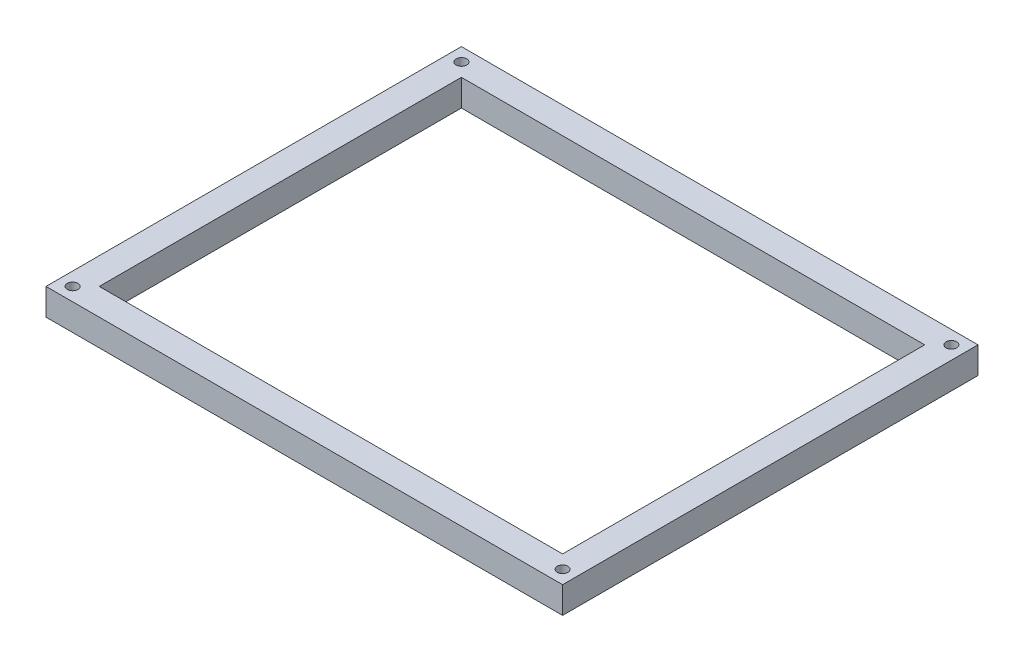
ISO-10303-21;
HEADER;
FILE_DESCRIPTION(('STEP AP214'),'2;1');
FILE_NAME('part.step','',(''),(''),'','','');
FILE_SCHEMA(('AUTOMOTIVE_DESIGN { 1 0 10303 214 1 1 1 1 }'));
ENDSEC;
DATA;
#1=APPLICATION_CONTEXT('core data for automotive mechanical design processes');
#2=APPLICATION_PROTOCOL_DEFINITION('international standard','automotive_design',2000,#1);
#3=PRODUCT_CONTEXT('',#1,'mechanical');
#4=PRODUCT('Part','Part','',(#3));
#5=PRODUCT_RELATED_PRODUCT_CATEGORY('part','',(#4));
#6=PRODUCT_DEFINITION_FORMATION('','',#4);
#7=PRODUCT_DEFINITION_CONTEXT('part definition',#1,'design');
#8=PRODUCT_DEFINITION('design','',#6,#7);
#9=PRODUCT_DEFINITION_SHAPE('','',#8);
#10=(LENGTH_UNIT() NAMED_UNIT(*) SI_UNIT(.MILLI.,.METRE.));
#11=(NAMED_UNIT(*) PLANE_ANGLE_UNIT() SI_UNIT($,.RADIAN.));
#12=(NAMED_UNIT(*) SI_UNIT($,.STERADIAN.) SOLID_ANGLE_UNIT());
#13=UNCERTAINTY_MEASURE_WITH_UNIT(LENGTH_MEASURE(1.E-05),#10,'distance_accuracy_value','');
#14=(GEOMETRIC_REPRESENTATION_CONTEXT(3) GLOBAL_UNCERTAINTY_ASSIGNED_CONTEXT((#13)) GLOBAL_UNIT_ASSIGNED_CONTEXT((#10,
#11,#12)) REPRESENTATION_CONTEXT('',''));
#15=CARTESIAN_POINT('',(0.,0.,0.));
#16=DIRECTION('',(0.,0.,1.));
#17=DIRECTION('',(1.,0.,0.));
#18=AXIS2_PLACEMENT_3D('',#15,#16,#17);
#19=CARTESIAN_POINT('',(0.,10.,0.));
#20=DIRECTION('',(0.,-1.,0.));
#21=DIRECTION('',(0.,0.,-1.));
#22=AXIS2_PLACEMENT_3D('',#19,#20,#21);
#23=PLANE('',#22);
#24=CARTESIAN_POINT('',(92.,10.,-73.));
#25=DIRECTION('',(0.,1.,0.));
#26=DIRECTION('',(0.,0.,1.));
#27=AXIS2_PLACEMENT_3D('',#24,#25,#26);
#28=CIRCLE('',#27,2.);
#29=CARTESIAN_POINT('',(92.,10.,-71.));
#30=VERTEX_POINT('',#29);
#31=EDGE_CURVE('E255',#30,#30,#28,.T.);
#32=ORIENTED_EDGE('',*,*,#31,.F.);
#33=EDGE_LOOP('',(#32));
#34=FACE_BOUND('',#33,.T.);
#35=CARTESIAN_POINT('',(92.,10.,73.));
#36=DIRECTION('',(0.,1.,0.));
#37=DIRECTION('',(0.,0.,1.));
#38=AXIS2_PLACEMENT_3D('',#35,#36,#37);
#39=CIRCLE('',#38,2.);
#40=CARTESIAN_POINT('',(92.,10.,75.));
#41=VERTEX_POINT('',#40);
#42=EDGE_CURVE('E247',#41,#41,#39,.T.);
#43=ORIENTED_EDGE('',*,*,#42,.F.);
#44=EDGE_LOOP('',(#43));
#45=FACE_BOUND('',#44,.T.);
#46=CARTESIAN_POINT('',(-92.0000000000001,10.,73.));
#47=DIRECTION('',(0.,1.,0.));
#48=DIRECTION('',(0.,0.,1.));
#49=AXIS2_PLACEMENT_3D('',#46,#47,#48);
#50=CIRCLE('',#49,2.);
#51=CARTESIAN_POINT('',(-92.0000000000001,10.,75.));
#52=VERTEX_POINT('',#51);
#53=EDGE_CURVE('E240',#52,#52,#50,.T.);
#54=ORIENTED_EDGE('',*,*,#53,.F.);
#55=EDGE_LOOP('',(#54));
#56=FACE_BOUND('',#55,.T.);
#57=CARTESIAN_POINT('',(-92.,10.,-73.));
#58=DIRECTION('',(0.,1.,0.));
#59=DIRECTION('',(0.,0.,1.));
#60=AXIS2_PLACEMENT_3D('',#57,#58,#59);
#61=CIRCLE('',#60,2.);
#62=CARTESIAN_POINT('',(-92.,10.,-71.));
#63=VERTEX_POINT('',#62);
#64=EDGE_CURVE('E244',#63,#63,#61,.T.);
#65=ORIENTED_EDGE('',*,*,#64,.F.);
#66=EDGE_LOOP('',(#65));
#67=FACE_BOUND('',#66,.T.);
#68=DIRECTION('',(0.,0.,-1.));
#69=VECTOR('',#68,1.);
#70=CARTESIAN_POINT('',(97.,10.,78.));
#71=LINE('',#70,#69);
#72=CARTESIAN_POINT('',(97.,10.,78.));
#73=VERTEX_POINT('',#72);
#74=CARTESIAN_POINT('',(97.,10.,-78.));
#75=VERTEX_POINT('',#74);
#76=EDGE_CURVE('E137',#73,#75,#71,.T.);
#77=ORIENTED_EDGE('',*,*,#76,.T.);
#78=DIRECTION('',(-1.,0.,0.));
#79=VECTOR('',#78,1.);
#80=CARTESIAN_POINT('',(-97.,10.,-78.));
#81=LINE('',#80,#79);
#82=CARTESIAN_POINT('',(-97.,10.,-78.));
#83=VERTEX_POINT('',#82);
#84=EDGE_CURVE('E140',#75,#83,#81,.T.);
#85=ORIENTED_EDGE('',*,*,#84,.T.);
#86=DIRECTION('',(0.,0.,1.));
#87=VECTOR('',#86,1.);
#88=CARTESIAN_POINT('',(-97.,10.,78.));
#89=LINE('',#88,#87);
#90=CARTESIAN_POINT('',(-97.,10.,78.));
#91=VERTEX_POINT('',#90);
#92=EDGE_CURVE('E143',#83,#91,#89,.T.);
#93=ORIENTED_EDGE('',*,*,#92,.T.);
#94=DIRECTION('',(1.,0.,0.));
#95=VECTOR('',#94,1.);
#96=CARTESIAN_POINT('',(-97.,10.,78.));
#97=LINE('',#96,#95);
#98=EDGE_CURVE('E145',#91,#73,#97,.T.);
#99=ORIENTED_EDGE('',*,*,#98,.T.);
#100=EDGE_LOOP('',(#77,#85,#93,#99));
#101=FACE_BOUND('',#100,.T.);
#102=DIRECTION('',(0.,0.,1.));
#103=VECTOR('',#102,1.);
#104=CARTESIAN_POINT('',(-87.,10.,68.));
#105=LINE('',#104,#103);
#106=CARTESIAN_POINT('',(-87.,10.,-68.));
#107=VERTEX_POINT('',#106);
#108=CARTESIAN_POINT('',(-87.,10.,68.));
#109=VERTEX_POINT('',#108);
#110=EDGE_CURVE('E99',#107,#109,#105,.T.);
#111=ORIENTED_EDGE('',*,*,#110,.F.);
#112=DIRECTION('',(-1.,0.,0.));
#113=VECTOR('',#112,1.);
#114=CARTESIAN_POINT('',(-87.,10.,-68.));
#115=LINE('',#114,#113);
#116=CARTESIAN_POINT('',(87.,10.,-68.));
#117=VERTEX_POINT('',#116);
#118=EDGE_CURVE('E121',#117,#107,#115,.T.);
#119=ORIENTED_EDGE('',*,*,#118,.F.);
#120=DIRECTION('',(0.,0.,-1.));
#121=VECTOR('',#120,1.);
#122=CARTESIAN_POINT('',(87.,10.,68.));
#123=LINE('',#122,#121);
#124=CARTESIAN_POINT('',(87.,10.,68.));
#125=VERTEX_POINT('',#124);
#126=EDGE_CURVE('E119',#125,#117,#123,.T.);
#127=ORIENTED_EDGE('',*,*,#126,.F.);
#128=DIRECTION('',(1.,0.,0.));
#129=VECTOR('',#128,1.);
#130=CARTESIAN_POINT('',(-87.,10.,68.));
#131=LINE('',#130,#129);
#132=EDGE_CURVE('E107',#109,#125,#131,.T.);
#133=ORIENTED_EDGE('',*,*,#132,.F.);
#134=EDGE_LOOP('',(#111,#119,#127,#133));
#135=FACE_BOUND('',#134,.T.);
#136=ADVANCED_FACE('F34',(#34,#45,#56,#67,#101,#135),#23,.F.);
#137=CARTESIAN_POINT('',(0.,0.,0.));
#138=DIRECTION('',(0.,-1.,0.));
#139=DIRECTION('',(0.,0.,-1.));
#140=AXIS2_PLACEMENT_3D('',#137,#138,#139);
#141=PLANE('',#140);
#142=CARTESIAN_POINT('',(92.,0.,-73.));
#143=DIRECTION('',(0.,1.,0.));
#144=DIRECTION('',(0.,0.,1.));
#145=AXIS2_PLACEMENT_3D('',#142,#143,#144);
#146=CIRCLE('',#145,2.);
#147=CARTESIAN_POINT('',(92.,0.,-71.));
#148=VERTEX_POINT('',#147);
#149=EDGE_CURVE('E252',#148,#148,#146,.T.);
#150=ORIENTED_EDGE('',*,*,#149,.T.);
#151=EDGE_LOOP('',(#150));
#152=FACE_BOUND('',#151,.T.);
#153=CARTESIAN_POINT('',(92.,0.,73.));
#154=DIRECTION('',(0.,1.,0.));
#155=DIRECTION('',(0.,0.,1.));
#156=AXIS2_PLACEMENT_3D('',#153,#154,#155);
#157=CIRCLE('',#156,2.);
#158=CARTESIAN_POINT('',(92.,0.,75.));
#159=VERTEX_POINT('',#158);
#160=EDGE_CURVE('E242',#159,#159,#157,.T.);
#161=ORIENTED_EDGE('',*,*,#160,.T.);
#162=EDGE_LOOP('',(#161));
#163=FACE_BOUND('',#162,.T.);
#164=CARTESIAN_POINT('',(-92.0000000000001,0.,73.));
#165=DIRECTION('',(0.,1.,0.));
#166=DIRECTION('',(0.,0.,1.));
#167=AXIS2_PLACEMENT_3D('',#164,#165,#166);
#168=CIRCLE('',#167,2.);
#169=CARTESIAN_POINT('',(-92.0000000000001,0.,75.));
#170=VERTEX_POINT('',#169);
#171=EDGE_CURVE('E237',#170,#170,#168,.T.);
#172=ORIENTED_EDGE('',*,*,#171,.T.);
#173=EDGE_LOOP('',(#172));
#174=FACE_BOUND('',#173,.T.);
#175=CARTESIAN_POINT('',(-92.,0.,-73.));
#176=DIRECTION('',(0.,1.,0.));
#177=DIRECTION('',(0.,0.,1.));
#178=AXIS2_PLACEMENT_3D('',#175,#176,#177);
#179=CIRCLE('',#178,2.);
#180=CARTESIAN_POINT('',(-92.,0.,-71.));
#181=VERTEX_POINT('',#180);
#182=EDGE_CURVE('E127',#181,#181,#179,.T.);
#183=ORIENTED_EDGE('',*,*,#182,.T.);
#184=EDGE_LOOP('',(#183));
#185=FACE_BOUND('',#184,.T.);
#186=DIRECTION('',(0.,0.,-1.));
#187=VECTOR('',#186,1.);
#188=CARTESIAN_POINT('',(97.,0.,78.));
#189=LINE('',#188,#187);
#190=CARTESIAN_POINT('',(97.,0.,78.));
#191=VERTEX_POINT('',#190);
#192=CARTESIAN_POINT('',(97.,0.,-78.));
#193=VERTEX_POINT('',#192);
#194=EDGE_CURVE('E115',#191,#193,#189,.T.);
#195=ORIENTED_EDGE('',*,*,#194,.F.);
#196=DIRECTION('',(1.,0.,0.));
#197=VECTOR('',#196,1.);
#198=CARTESIAN_POINT('',(-97.,0.,78.));
#199=LINE('',#198,#197);
#200=CARTESIAN_POINT('',(-97.,0.,78.));
#201=VERTEX_POINT('',#200);
#202=EDGE_CURVE('E141',#201,#191,#199,.T.);
#203=ORIENTED_EDGE('',*,*,#202,.F.);
#204=DIRECTION('',(0.,0.,1.));
#205=VECTOR('',#204,1.);
#206=CARTESIAN_POINT('',(-97.,0.,78.));
#207=LINE('',#206,#205);
#208=CARTESIAN_POINT('',(-97.,0.,-78.));
#209=VERTEX_POINT('',#208);
#210=EDGE_CURVE('E152',#209,#201,#207,.T.);
#211=ORIENTED_EDGE('',*,*,#210,.F.);
#212=DIRECTION('',(-1.,0.,0.));
#213=VECTOR('',#212,1.);
#214=CARTESIAN_POINT('',(-97.,0.,-78.));
#215=LINE('',#214,#213);
#216=EDGE_CURVE('E150',#193,#209,#215,.T.);
#217=ORIENTED_EDGE('',*,*,#216,.F.);
#218=EDGE_LOOP('',(#195,#203,#211,#217));
#219=FACE_BOUND('',#218,.T.);
#220=DIRECTION('',(-1.,0.,0.));
#221=VECTOR('',#220,1.);
#222=CARTESIAN_POINT('',(-87.,0.,-68.));
#223=LINE('',#222,#221);
#224=CARTESIAN_POINT('',(87.,0.,-68.));
#225=VERTEX_POINT('',#224);
#226=CARTESIAN_POINT('',(-87.,0.,-68.));
#227=VERTEX_POINT('',#226);
#228=EDGE_CURVE('E108',#225,#227,#223,.T.);
#229=ORIENTED_EDGE('',*,*,#228,.T.);
#230=DIRECTION('',(0.,0.,1.));
#231=VECTOR('',#230,1.);
#232=CARTESIAN_POINT('',(-87.,0.,68.));
#233=LINE('',#232,#231);
#234=CARTESIAN_POINT('',(-87.,0.,68.));
#235=VERTEX_POINT('',#234);
#236=EDGE_CURVE('E57',#227,#235,#233,.T.);
#237=ORIENTED_EDGE('',*,*,#236,.T.);
#238=DIRECTION('',(1.,0.,0.));
#239=VECTOR('',#238,1.);
#240=CARTESIAN_POINT('',(-87.,0.,68.));
#241=LINE('',#240,#239);
#242=CARTESIAN_POINT('',(87.,0.,68.));
#243=VERTEX_POINT('',#242);
#244=EDGE_CURVE('E114',#235,#243,#241,.T.);
#245=ORIENTED_EDGE('',*,*,#244,.T.);
#246=DIRECTION('',(0.,0.,-1.));
#247=VECTOR('',#246,1.);
#248=CARTESIAN_POINT('',(87.,0.,68.));
#249=LINE('',#248,#247);
#250=EDGE_CURVE('E129',#243,#225,#249,.T.);
#251=ORIENTED_EDGE('',*,*,#250,.T.);
#252=EDGE_LOOP('',(#229,#237,#245,#251));
#253=FACE_BOUND('',#252,.T.);
#254=ADVANCED_FACE('F170',(#152,#163,#174,#185,#219,#253),#141,.T.);
#255=CARTESIAN_POINT('',(97.,10.,78.));
#256=DIRECTION('',(-1.,0.,0.));
#257=DIRECTION('',(0.,0.,1.));
#258=AXIS2_PLACEMENT_3D('',#255,#256,#257);
#259=PLANE('',#258);
#260=ORIENTED_EDGE('',*,*,#194,.T.);
#261=DIRECTION('',(0.,-1.,0.));
#262=VECTOR('',#261,1.);
#263=CARTESIAN_POINT('',(97.,10.,-78.));
#264=LINE('',#263,#262);
#265=EDGE_CURVE('E11',#75,#193,#264,.T.);
#266=ORIENTED_EDGE('',*,*,#265,.F.);
#267=ORIENTED_EDGE('',*,*,#76,.F.);
#268=DIRECTION('',(0.,-1.,0.));
#269=VECTOR('',#268,1.);
#270=CARTESIAN_POINT('',(97.,10.,78.));
#271=LINE('',#270,#269);
#272=EDGE_CURVE('E147',#73,#191,#271,.T.);
#273=ORIENTED_EDGE('',*,*,#272,.T.);
#274=EDGE_LOOP('',(#260,#266,#267,#273));
#275=FACE_BOUND('',#274,.T.);
#276=ADVANCED_FACE('F36',(#275),#259,.F.);
#277=CARTESIAN_POINT('',(-97.,10.,-78.));
#278=DIRECTION('',(0.,0.,1.));
#279=DIRECTION('',(1.,0.,0.));
#280=AXIS2_PLACEMENT_3D('',#277,#278,#279);
#281=PLANE('',#280);
#282=ORIENTED_EDGE('',*,*,#216,.T.);
#283=DIRECTION('',(0.,-1.,0.));
#284=VECTOR('',#283,1.);
#285=CARTESIAN_POINT('',(-97.,10.,-78.));
#286=LINE('',#285,#284);
#287=EDGE_CURVE('E42',#83,#209,#286,.T.);
#288=ORIENTED_EDGE('',*,*,#287,.F.);
#289=ORIENTED_EDGE('',*,*,#84,.F.);
#290=ORIENTED_EDGE('',*,*,#265,.T.);
#291=EDGE_LOOP('',(#282,#288,#289,#290));
#292=FACE_BOUND('',#291,.T.);
#293=ADVANCED_FACE('F180',(#292),#281,.F.);
#294=CARTESIAN_POINT('',(-97.,10.,78.));
#295=DIRECTION('',(1.,0.,0.));
#296=DIRECTION('',(0.,0.,-1.));
#297=AXIS2_PLACEMENT_3D('',#294,#295,#296);
#298=PLANE('',#297);
#299=ORIENTED_EDGE('',*,*,#210,.T.);
#300=DIRECTION('',(0.,-1.,0.));
#301=VECTOR('',#300,1.);
#302=CARTESIAN_POINT('',(-97.,10.,78.));
#303=LINE('',#302,#301);
#304=EDGE_CURVE('E157',#91,#201,#303,.T.);
#305=ORIENTED_EDGE('',*,*,#304,.F.);
#306=ORIENTED_EDGE('',*,*,#92,.F.);
#307=ORIENTED_EDGE('',*,*,#287,.T.);
#308=EDGE_LOOP('',(#299,#305,#306,#307));
#309=FACE_BOUND('',#308,.T.);
#310=ADVANCED_FACE('F164',(#309),#298,.F.);
#311=CARTESIAN_POINT('',(-97.,10.,78.));
#312=DIRECTION('',(0.,0.,-1.));
#313=DIRECTION('',(-1.,0.,0.));
#314=AXIS2_PLACEMENT_3D('',#311,#312,#313);
#315=PLANE('',#314);
#316=ORIENTED_EDGE('',*,*,#202,.T.);
#317=ORIENTED_EDGE('',*,*,#272,.F.);
#318=ORIENTED_EDGE('',*,*,#98,.F.);
#319=ORIENTED_EDGE('',*,*,#304,.T.);
#320=EDGE_LOOP('',(#316,#317,#318,#319));
#321=FACE_BOUND('',#320,.T.);
#322=ADVANCED_FACE('F174',(#321),#315,.F.);
#323=CARTESIAN_POINT('',(-87.,10.,68.));
#324=DIRECTION('',(1.,0.,0.));
#325=DIRECTION('',(0.,0.,-1.));
#326=AXIS2_PLACEMENT_3D('',#323,#324,#325);
#327=PLANE('',#326);
#328=ORIENTED_EDGE('',*,*,#236,.F.);
#329=DIRECTION('',(0.,-1.,0.));
#330=VECTOR('',#329,1.);
#331=CARTESIAN_POINT('',(-87.,10.,-68.));
#332=LINE('',#331,#330);
#333=EDGE_CURVE('E103',#107,#227,#332,.T.);
#334=ORIENTED_EDGE('',*,*,#333,.F.);
#335=ORIENTED_EDGE('',*,*,#110,.T.);
#336=DIRECTION('',(0.,-1.,0.));
#337=VECTOR('',#336,1.);
#338=CARTESIAN_POINT('',(-87.,10.,68.));
#339=LINE('',#338,#337);
#340=EDGE_CURVE('E102',#109,#235,#339,.T.);
#341=ORIENTED_EDGE('',*,*,#340,.T.);
#342=EDGE_LOOP('',(#328,#334,#335,#341));
#343=FACE_BOUND('',#342,.T.);
#344=ADVANCED_FACE('F101',(#343),#327,.T.);
#345=CARTESIAN_POINT('',(-87.,10.,68.));
#346=DIRECTION('',(0.,0.,-1.));
#347=DIRECTION('',(-1.,0.,0.));
#348=AXIS2_PLACEMENT_3D('',#345,#346,#347);
#349=PLANE('',#348);
#350=ORIENTED_EDGE('',*,*,#244,.F.);
#351=ORIENTED_EDGE('',*,*,#340,.F.);
#352=ORIENTED_EDGE('',*,*,#132,.T.);
#353=DIRECTION('',(0.,-1.,0.));
#354=VECTOR('',#353,1.);
#355=CARTESIAN_POINT('',(87.,10.,68.));
#356=LINE('',#355,#354);
#357=EDGE_CURVE('E116',#125,#243,#356,.T.);
#358=ORIENTED_EDGE('',*,*,#357,.T.);
#359=EDGE_LOOP('',(#350,#351,#352,#358));
#360=FACE_BOUND('',#359,.T.);
#361=ADVANCED_FACE('F111',(#360),#349,.T.);
#362=CARTESIAN_POINT('',(87.,10.,68.));
#363=DIRECTION('',(-1.,0.,0.));
#364=DIRECTION('',(0.,0.,1.));
#365=AXIS2_PLACEMENT_3D('',#362,#363,#364);
#366=PLANE('',#365);
#367=ORIENTED_EDGE('',*,*,#250,.F.);
#368=ORIENTED_EDGE('',*,*,#357,.F.);
#369=ORIENTED_EDGE('',*,*,#126,.T.);
#370=DIRECTION('',(0.,-1.,0.));
#371=VECTOR('',#370,1.);
#372=CARTESIAN_POINT('',(87.,10.,-68.));
#373=LINE('',#372,#371);
#374=EDGE_CURVE('E49',#117,#225,#373,.T.);
#375=ORIENTED_EDGE('',*,*,#374,.T.);
#376=EDGE_LOOP('',(#367,#368,#369,#375));
#377=FACE_BOUND('',#376,.T.);
#378=ADVANCED_FACE('F207',(#377),#366,.T.);
#379=CARTESIAN_POINT('',(-87.,10.,-68.));
#380=DIRECTION('',(0.,0.,1.));
#381=DIRECTION('',(1.,0.,0.));
#382=AXIS2_PLACEMENT_3D('',#379,#380,#381);
#383=PLANE('',#382);
#384=ORIENTED_EDGE('',*,*,#228,.F.);
#385=ORIENTED_EDGE('',*,*,#374,.F.);
#386=ORIENTED_EDGE('',*,*,#118,.T.);
#387=ORIENTED_EDGE('',*,*,#333,.T.);
#388=EDGE_LOOP('',(#384,#385,#386,#387));
#389=FACE_BOUND('',#388,.T.);
#390=ADVANCED_FACE('F211',(#389),#383,.T.);
#391=CARTESIAN_POINT('',(-92.,0.,-73.));
#392=DIRECTION('',(0.,1.,0.));
#393=DIRECTION('',(0.,0.,1.));
#394=AXIS2_PLACEMENT_3D('',#391,#392,#393);
#395=CYLINDRICAL_SURFACE('',#394,2.);
#396=ORIENTED_EDGE('',*,*,#182,.F.);
#397=EDGE_LOOP('',(#396));
#398=FACE_BOUND('',#397,.T.);
#399=ORIENTED_EDGE('',*,*,#64,.T.);
#400=EDGE_LOOP('',(#399));
#401=FACE_BOUND('',#400,.T.);
#402=ADVANCED_FACE('F217',(#398,#401),#395,.F.);
#403=CARTESIAN_POINT('',(-92.0000000000001,0.,73.));
#404=DIRECTION('',(0.,1.,0.));
#405=DIRECTION('',(0.,0.,1.));
#406=AXIS2_PLACEMENT_3D('',#403,#404,#405);
#407=CYLINDRICAL_SURFACE('',#406,2.);
#408=ORIENTED_EDGE('',*,*,#171,.F.);
#409=EDGE_LOOP('',(#408));
#410=FACE_BOUND('',#409,.T.);
#411=ORIENTED_EDGE('',*,*,#53,.T.);
#412=EDGE_LOOP('',(#411));
#413=FACE_BOUND('',#412,.T.);
#414=ADVANCED_FACE('F220',(#410,#413),#407,.F.);
#415=CARTESIAN_POINT('',(92.,0.,73.));
#416=DIRECTION('',(0.,1.,0.));
#417=DIRECTION('',(0.,0.,1.));
#418=AXIS2_PLACEMENT_3D('',#415,#416,#417);
#419=CYLINDRICAL_SURFACE('',#418,2.);
#420=ORIENTED_EDGE('',*,*,#160,.F.);
#421=EDGE_LOOP('',(#420));
#422=FACE_BOUND('',#421,.T.);
#423=ORIENTED_EDGE('',*,*,#42,.T.);
#424=EDGE_LOOP('',(#423));
#425=FACE_BOUND('',#424,.T.);
#426=ADVANCED_FACE('F225',(#422,#425),#419,.F.);
#427=CARTESIAN_POINT('',(92.,0.,-73.));
#428=DIRECTION('',(0.,1.,0.));
#429=DIRECTION('',(0.,0.,1.));
#430=AXIS2_PLACEMENT_3D('',#427,#428,#429);
#431=CYLINDRICAL_SURFACE('',#430,2.);
#432=ORIENTED_EDGE('',*,*,#149,.F.);
#433=EDGE_LOOP('',(#432));
#434=FACE_BOUND('',#433,.T.);
#435=ORIENTED_EDGE('',*,*,#31,.T.);
#436=EDGE_LOOP('',(#435));
#437=FACE_BOUND('',#436,.T.);
#438=ADVANCED_FACE('F222',(#434,#437),#431,.F.);
#439=CLOSED_SHELL('',(#136,#254,#276,#293,#310,#322,#344,#361,#378,#390,#402,#414,#426,#438));
#440=MANIFOLD_SOLID_BREP('B2',#439);
#441=ADVANCED_BREP_SHAPE_REPRESENTATION('',(#18,#440),#14);
#442=SHAPE_DEFINITION_REPRESENTATION(#9,#441);
ENDSEC;
END-ISO-10303-21;
